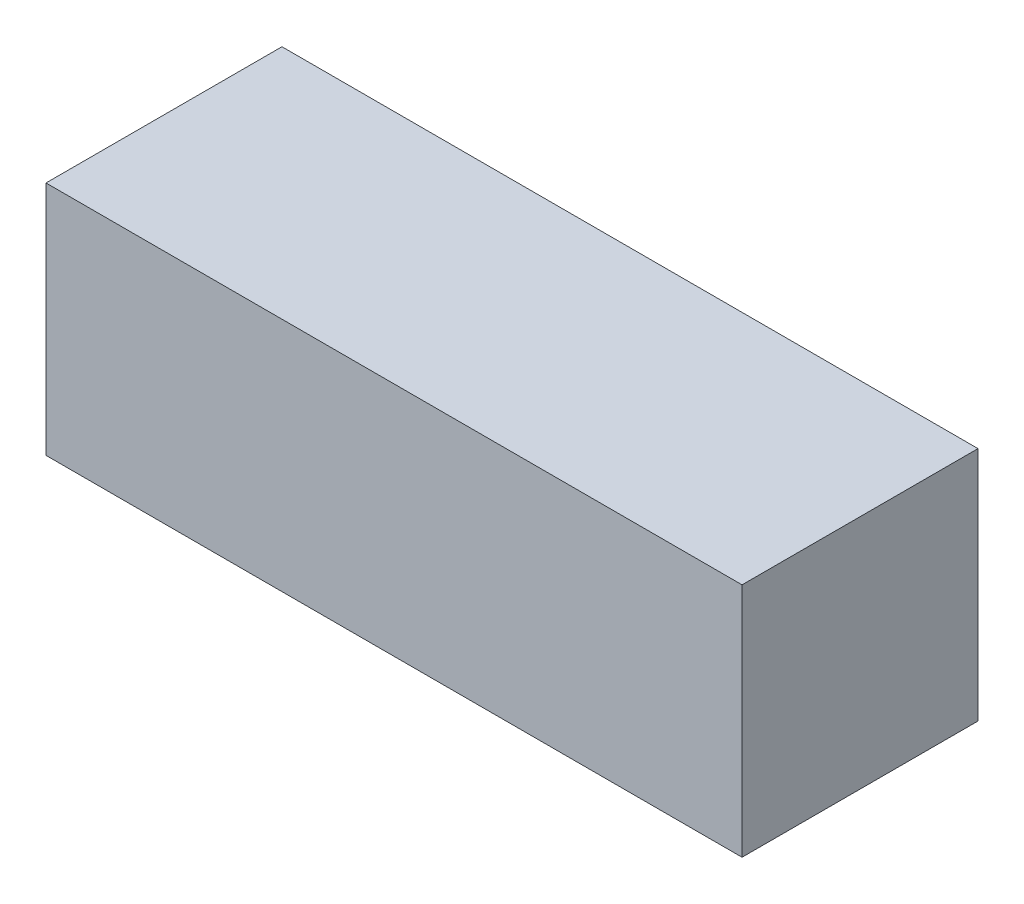
ISO-10303-21;
HEADER;
FILE_DESCRIPTION(('STEP AP214'),'2;1');
FILE_NAME('part.step','',(''),(''),'','','');
FILE_SCHEMA(('AUTOMOTIVE_DESIGN { 1 0 10303 214 1 1 1 1 }'));
ENDSEC;
DATA;
#1=APPLICATION_CONTEXT('core data for automotive mechanical design processes');
#2=APPLICATION_PROTOCOL_DEFINITION('international standard','automotive_design',2000,#1);
#3=PRODUCT_CONTEXT('',#1,'mechanical');
#4=PRODUCT('Part','Part','',(#3));
#5=PRODUCT_RELATED_PRODUCT_CATEGORY('part','',(#4));
#6=PRODUCT_DEFINITION_FORMATION('','',#4);
#7=PRODUCT_DEFINITION_CONTEXT('part definition',#1,'design');
#8=PRODUCT_DEFINITION('design','',#6,#7);
#9=PRODUCT_DEFINITION_SHAPE('','',#8);
#10=(LENGTH_UNIT() NAMED_UNIT(*) SI_UNIT(.MILLI.,.METRE.));
#11=(NAMED_UNIT(*) PLANE_ANGLE_UNIT() SI_UNIT($,.RADIAN.));
#12=(NAMED_UNIT(*) SI_UNIT($,.STERADIAN.) SOLID_ANGLE_UNIT());
#13=UNCERTAINTY_MEASURE_WITH_UNIT(LENGTH_MEASURE(1.E-05),#10,'distance_accuracy_value','');
#14=(GEOMETRIC_REPRESENTATION_CONTEXT(3) GLOBAL_UNCERTAINTY_ASSIGNED_CONTEXT((#13)) GLOBAL_UNIT_ASSIGNED_CONTEXT((#10,
#11,#12)) REPRESENTATION_CONTEXT('',''));
#15=CARTESIAN_POINT('',(0.,0.,0.));
#16=DIRECTION('',(0.,0.,1.));
#17=DIRECTION('',(1.,0.,0.));
#18=AXIS2_PLACEMENT_3D('',#15,#16,#17);
#19=CARTESIAN_POINT('',(-29.5,20.,10.));
#20=DIRECTION('',(1.,0.,0.));
#21=DIRECTION('',(0.,0.,-1.));
#22=AXIS2_PLACEMENT_3D('',#19,#20,#21);
#23=PLANE('',#22);
#24=DIRECTION('',(0.,0.,1.));
#25=VECTOR('',#24,1.);
#26=CARTESIAN_POINT('',(-29.5,0.,10.));
#27=LINE('',#26,#25);
#28=CARTESIAN_POINT('',(-29.5,0.,-10.));
#29=VERTEX_POINT('',#28);
#30=CARTESIAN_POINT('',(-29.5,0.,10.));
#31=VERTEX_POINT('',#30);
#32=EDGE_CURVE('E102',#29,#31,#27,.T.);
#33=ORIENTED_EDGE('',*,*,#32,.T.);
#34=DIRECTION('',(0.,-1.,0.));
#35=VECTOR('',#34,1.);
#36=CARTESIAN_POINT('',(-29.5,20.,10.));
#37=LINE('',#36,#35);
#38=CARTESIAN_POINT('',(-29.5,20.,10.));
#39=VERTEX_POINT('',#38);
#40=EDGE_CURVE('E11',#39,#31,#37,.T.);
#41=ORIENTED_EDGE('',*,*,#40,.F.);
#42=DIRECTION('',(0.,0.,1.));
#43=VECTOR('',#42,1.);
#44=CARTESIAN_POINT('',(-29.5,20.,10.));
#45=LINE('',#44,#43);
#46=CARTESIAN_POINT('',(-29.5,20.,-10.));
#47=VERTEX_POINT('',#46);
#48=EDGE_CURVE('E90',#47,#39,#45,.T.);
#49=ORIENTED_EDGE('',*,*,#48,.F.);
#50=DIRECTION('',(0.,-1.,0.));
#51=VECTOR('',#50,1.);
#52=CARTESIAN_POINT('',(-29.5,20.,-10.));
#53=LINE('',#52,#51);
#54=EDGE_CURVE('E98',#47,#29,#53,.T.);
#55=ORIENTED_EDGE('',*,*,#54,.T.);
#56=EDGE_LOOP('',(#33,#41,#49,#55));
#57=FACE_BOUND('',#56,.T.);
#58=ADVANCED_FACE('F39',(#57),#23,.F.);
#59=CARTESIAN_POINT('',(29.5,20.,9.99999999999999));
#60=DIRECTION('',(0.,0.,-1.));
#61=DIRECTION('',(-1.,0.,0.));
#62=AXIS2_PLACEMENT_3D('',#59,#60,#61);
#63=PLANE('',#62);
#64=DIRECTION('',(1.,0.,0.));
#65=VECTOR('',#64,1.);
#66=CARTESIAN_POINT('',(29.5,0.,9.99999999999999));
#67=LINE('',#66,#65);
#68=CARTESIAN_POINT('',(29.5,0.,9.99999999999999));
#69=VERTEX_POINT('',#68);
#70=EDGE_CURVE('E94',#31,#69,#67,.T.);
#71=ORIENTED_EDGE('',*,*,#70,.T.);
#72=DIRECTION('',(0.,-1.,0.));
#73=VECTOR('',#72,1.);
#74=CARTESIAN_POINT('',(29.5,20.,9.99999999999999));
#75=LINE('',#74,#73);
#76=CARTESIAN_POINT('',(29.5,20.,9.99999999999999));
#77=VERTEX_POINT('',#76);
#78=EDGE_CURVE('E47',#77,#69,#75,.T.);
#79=ORIENTED_EDGE('',*,*,#78,.F.);
#80=DIRECTION('',(1.,0.,0.));
#81=VECTOR('',#80,1.);
#82=CARTESIAN_POINT('',(29.5,20.,9.99999999999999));
#83=LINE('',#82,#81);
#84=EDGE_CURVE('E85',#39,#77,#83,.T.);
#85=ORIENTED_EDGE('',*,*,#84,.F.);
#86=ORIENTED_EDGE('',*,*,#40,.T.);
#87=EDGE_LOOP('',(#71,#79,#85,#86));
#88=FACE_BOUND('',#87,.T.);
#89=ADVANCED_FACE('F93',(#88),#63,.F.);
#90=CARTESIAN_POINT('',(29.5,20.,9.99999999999999));
#91=DIRECTION('',(-1.,0.,0.));
#92=DIRECTION('',(0.,0.,1.));
#93=AXIS2_PLACEMENT_3D('',#90,#91,#92);
#94=PLANE('',#93);
#95=DIRECTION('',(0.,0.,-1.));
#96=VECTOR('',#95,1.);
#97=CARTESIAN_POINT('',(29.5,0.,9.99999999999999));
#98=LINE('',#97,#96);
#99=CARTESIAN_POINT('',(29.5,0.,-10.));
#100=VERTEX_POINT('',#99);
#101=EDGE_CURVE('E72',#69,#100,#98,.T.);
#102=ORIENTED_EDGE('',*,*,#101,.T.);
#103=DIRECTION('',(0.,-1.,0.));
#104=VECTOR('',#103,1.);
#105=CARTESIAN_POINT('',(29.5,20.,-10.));
#106=LINE('',#105,#104);
#107=CARTESIAN_POINT('',(29.5,20.,-10.));
#108=VERTEX_POINT('',#107);
#109=EDGE_CURVE('E95',#108,#100,#106,.T.);
#110=ORIENTED_EDGE('',*,*,#109,.F.);
#111=DIRECTION('',(0.,0.,-1.));
#112=VECTOR('',#111,1.);
#113=CARTESIAN_POINT('',(29.5,20.,9.99999999999999));
#114=LINE('',#113,#112);
#115=EDGE_CURVE('E88',#77,#108,#114,.T.);
#116=ORIENTED_EDGE('',*,*,#115,.F.);
#117=ORIENTED_EDGE('',*,*,#78,.T.);
#118=EDGE_LOOP('',(#102,#110,#116,#117));
#119=FACE_BOUND('',#118,.T.);
#120=ADVANCED_FACE('F96',(#119),#94,.F.);
#121=CARTESIAN_POINT('',(29.5,20.,-10.));
#122=DIRECTION('',(0.,0.,1.));
#123=DIRECTION('',(1.,0.,0.));
#124=AXIS2_PLACEMENT_3D('',#121,#122,#123);
#125=PLANE('',#124);
#126=DIRECTION('',(-1.,0.,0.));
#127=VECTOR('',#126,1.);
#128=CARTESIAN_POINT('',(29.5,0.,-10.));
#129=LINE('',#128,#127);
#130=EDGE_CURVE('E78',#100,#29,#129,.T.);
#131=ORIENTED_EDGE('',*,*,#130,.T.);
#132=ORIENTED_EDGE('',*,*,#54,.F.);
#133=DIRECTION('',(-1.,0.,0.));
#134=VECTOR('',#133,1.);
#135=CARTESIAN_POINT('',(29.5,20.,-10.));
#136=LINE('',#135,#134);
#137=EDGE_CURVE('E55',#108,#47,#136,.T.);
#138=ORIENTED_EDGE('',*,*,#137,.F.);
#139=ORIENTED_EDGE('',*,*,#109,.T.);
#140=EDGE_LOOP('',(#131,#132,#138,#139));
#141=FACE_BOUND('',#140,.T.);
#142=ADVANCED_FACE('F109',(#141),#125,.F.);
#143=CARTESIAN_POINT('',(0.,20.,0.));
#144=DIRECTION('',(0.,1.,0.));
#145=DIRECTION('',(0.,0.,1.));
#146=AXIS2_PLACEMENT_3D('',#143,#144,#145);
#147=PLANE('',#146);
#148=ORIENTED_EDGE('',*,*,#48,.T.);
#149=ORIENTED_EDGE('',*,*,#84,.T.);
#150=ORIENTED_EDGE('',*,*,#115,.T.);
#151=ORIENTED_EDGE('',*,*,#137,.T.);
#152=EDGE_LOOP('',(#148,#149,#150,#151));
#153=FACE_BOUND('',#152,.T.);
#154=ADVANCED_FACE('F86',(#153),#147,.T.);
#155=CARTESIAN_POINT('',(0.,0.,0.));
#156=DIRECTION('',(0.,1.,0.));
#157=DIRECTION('',(0.,0.,1.));
#158=AXIS2_PLACEMENT_3D('',#155,#156,#157);
#159=PLANE('',#158);
#160=ORIENTED_EDGE('',*,*,#32,.F.);
#161=ORIENTED_EDGE('',*,*,#130,.F.);
#162=ORIENTED_EDGE('',*,*,#101,.F.);
#163=ORIENTED_EDGE('',*,*,#70,.F.);
#164=EDGE_LOOP('',(#160,#161,#162,#163));
#165=FACE_BOUND('',#164,.T.);
#166=ADVANCED_FACE('F112',(#165),#159,.F.);
#167=CLOSED_SHELL('',(#58,#89,#120,#142,#154,#166));
#168=MANIFOLD_SOLID_BREP('B2',#167);
#169=ADVANCED_BREP_SHAPE_REPRESENTATION('',(#18,#168),#14);
#170=SHAPE_DEFINITION_REPRESENTATION(#9,#169);
ENDSEC;
END-ISO-10303-21;
